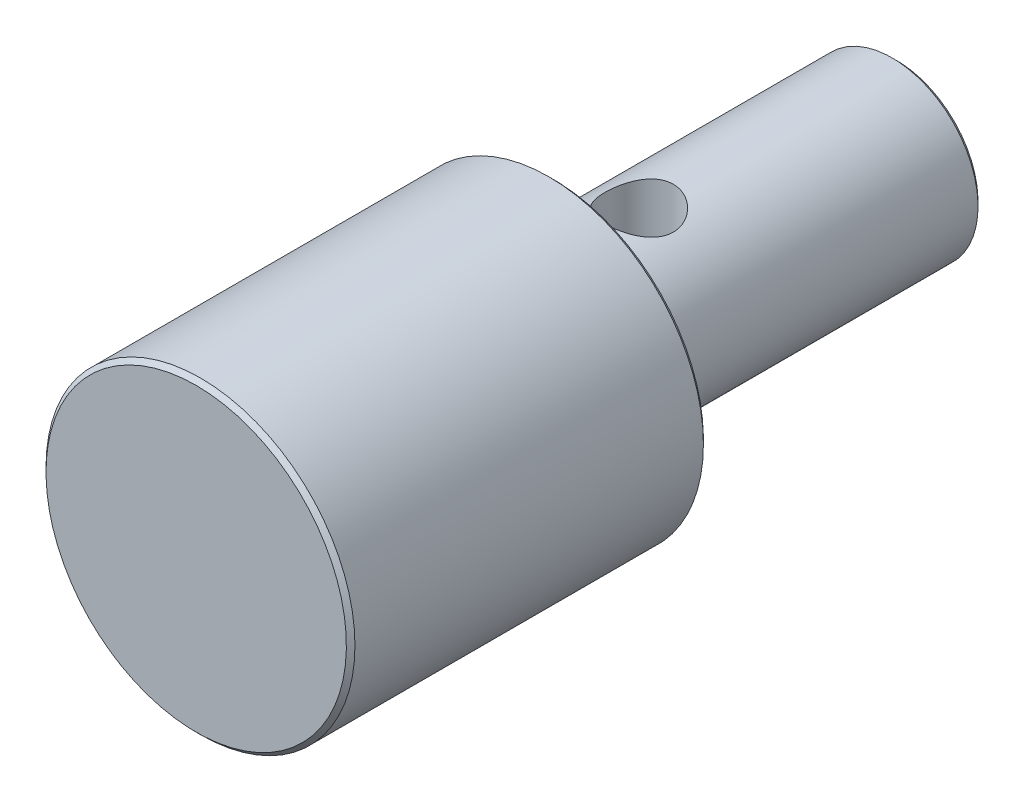
ISO-10303-21;
HEADER;
FILE_DESCRIPTION(('STEP AP214'),'2;1');
FILE_NAME('part.step','',(''),(''),'','','');
FILE_SCHEMA(('AUTOMOTIVE_DESIGN { 1 0 10303 214 1 1 1 1 }'));
ENDSEC;
DATA;
#1=APPLICATION_CONTEXT('core data for automotive mechanical design processes');
#2=APPLICATION_PROTOCOL_DEFINITION('international standard','automotive_design',2000,#1);
#3=PRODUCT_CONTEXT('',#1,'mechanical');
#4=PRODUCT('Part','Part','',(#3));
#5=PRODUCT_RELATED_PRODUCT_CATEGORY('part','',(#4));
#6=PRODUCT_DEFINITION_FORMATION('','',#4);
#7=PRODUCT_DEFINITION_CONTEXT('part definition',#1,'design');
#8=PRODUCT_DEFINITION('design','',#6,#7);
#9=PRODUCT_DEFINITION_SHAPE('','',#8);
#10=(LENGTH_UNIT() NAMED_UNIT(*) SI_UNIT(.MILLI.,.METRE.));
#11=(NAMED_UNIT(*) PLANE_ANGLE_UNIT() SI_UNIT($,.RADIAN.));
#12=(NAMED_UNIT(*) SI_UNIT($,.STERADIAN.) SOLID_ANGLE_UNIT());
#13=UNCERTAINTY_MEASURE_WITH_UNIT(LENGTH_MEASURE(1.E-05),#10,'distance_accuracy_value','');
#14=(GEOMETRIC_REPRESENTATION_CONTEXT(3) GLOBAL_UNCERTAINTY_ASSIGNED_CONTEXT((#13)) GLOBAL_UNIT_ASSIGNED_CONTEXT((#10,
#11,#12)) REPRESENTATION_CONTEXT('',''));
#15=CARTESIAN_POINT('',(0.,0.,0.));
#16=DIRECTION('',(0.,0.,1.));
#17=DIRECTION('',(1.,0.,0.));
#18=AXIS2_PLACEMENT_3D('',#15,#16,#17);
#19=CARTESIAN_POINT('',(0.,0.,0.));
#20=DIRECTION('',(0.,0.,-1.));
#21=DIRECTION('',(0.,1.,0.));
#22=AXIS2_PLACEMENT_3D('',#19,#20,#21);
#23=PLANE('',#22);
#24=CARTESIAN_POINT('',(0.,0.,0.));
#25=DIRECTION('',(0.,0.,-1.));
#26=DIRECTION('',(0.,1.,0.));
#27=AXIS2_PLACEMENT_3D('',#24,#25,#26);
#28=CIRCLE('',#27,17.5);
#29=CARTESIAN_POINT('',(0.,17.5,0.));
#30=VERTEX_POINT('',#29);
#31=EDGE_CURVE('E65',#30,#30,#28,.F.);
#32=ORIENTED_EDGE('',*,*,#31,.T.);
#33=EDGE_LOOP('',(#32));
#34=FACE_BOUND('',#33,.T.);
#35=ADVANCED_FACE('F37',(#34),#23,.F.);
#36=CARTESIAN_POINT('',(0.,0.,0.));
#37=DIRECTION('',(0.,0.,1.));
#38=DIRECTION('',(0.,-1.,0.));
#39=AXIS2_PLACEMENT_3D('',#36,#37,#38);
#40=CYLINDRICAL_SURFACE('',#39,18.);
#41=CARTESIAN_POINT('',(0.,0.,-0.500000000000004));
#42=DIRECTION('',(0.,0.,-1.));
#43=DIRECTION('',(0.,1.,0.));
#44=AXIS2_PLACEMENT_3D('',#41,#42,#43);
#45=CIRCLE('',#44,18.);
#46=CARTESIAN_POINT('',(0.,18.,-0.500000000000004));
#47=VERTEX_POINT('',#46);
#48=EDGE_CURVE('E55',#47,#47,#45,.T.);
#49=ORIENTED_EDGE('',*,*,#48,.T.);
#50=EDGE_LOOP('',(#49));
#51=FACE_BOUND('',#50,.T.);
#52=CARTESIAN_POINT('',(0.,0.,-41.1));
#53=DIRECTION('',(0.,0.,1.));
#54=DIRECTION('',(0.,-1.,0.));
#55=AXIS2_PLACEMENT_3D('',#52,#53,#54);
#56=CIRCLE('',#55,18.);
#57=CARTESIAN_POINT('',(0.,-18.,-41.1));
#58=VERTEX_POINT('',#57);
#59=EDGE_CURVE('E61',#58,#58,#56,.T.);
#60=ORIENTED_EDGE('',*,*,#59,.T.);
#61=EDGE_LOOP('',(#60));
#62=FACE_BOUND('',#61,.T.);
#63=ADVANCED_FACE('F107',(#51,#62),#40,.T.);
#64=CARTESIAN_POINT('',(0.,18.,-41.6));
#65=DIRECTION('',(0.,0.,1.));
#66=DIRECTION('',(0.,-1.,0.));
#67=AXIS2_PLACEMENT_3D('',#64,#65,#66);
#68=PLANE('',#67);
#69=CARTESIAN_POINT('',(0.,0.,-41.6));
#70=DIRECTION('',(0.,0.,1.));
#71=DIRECTION('',(0.,-1.,0.));
#72=AXIS2_PLACEMENT_3D('',#69,#70,#71);
#73=CIRCLE('',#72,17.5);
#74=CARTESIAN_POINT('',(0.,-17.5,-41.6));
#75=VERTEX_POINT('',#74);
#76=EDGE_CURVE('E50',#75,#75,#73,.F.);
#77=ORIENTED_EDGE('',*,*,#76,.T.);
#78=EDGE_LOOP('',(#77));
#79=FACE_BOUND('',#78,.T.);
#80=CARTESIAN_POINT('',(0.,0.,-41.6));
#81=DIRECTION('',(0.,0.,1.));
#82=DIRECTION('',(0.,-1.,0.));
#83=AXIS2_PLACEMENT_3D('',#80,#81,#82);
#84=CIRCLE('',#83,10.5);
#85=CARTESIAN_POINT('',(0.,-10.5,-41.6));
#86=VERTEX_POINT('',#85);
#87=EDGE_CURVE('E73',#86,#86,#84,.T.);
#88=ORIENTED_EDGE('',*,*,#87,.T.);
#89=EDGE_LOOP('',(#88));
#90=FACE_BOUND('',#89,.T.);
#91=ADVANCED_FACE('F105',(#79,#90),#68,.F.);
#92=CARTESIAN_POINT('',(0.,0.,0.));
#93=DIRECTION('',(0.,0.,1.));
#94=DIRECTION('',(0.,-1.,0.));
#95=AXIS2_PLACEMENT_3D('',#92,#93,#94);
#96=CYLINDRICAL_SURFACE('',#95,10.);
#97=CARTESIAN_POINT('',(0.,0.,-81.1));
#98=DIRECTION('',(0.,0.,1.));
#99=DIRECTION('',(0.,-1.,0.));
#100=AXIS2_PLACEMENT_3D('',#97,#98,#99);
#101=CIRCLE('',#100,10.);
#102=CARTESIAN_POINT('',(0.,-10.,-81.1));
#103=VERTEX_POINT('',#102);
#104=EDGE_CURVE('E45',#103,#103,#101,.T.);
#105=ORIENTED_EDGE('',*,*,#104,.T.);
#106=EDGE_LOOP('',(#105));
#107=FACE_BOUND('',#106,.T.);
#108=CARTESIAN_POINT('',(0.,0.,-42.1));
#109=DIRECTION('',(0.,0.,1.));
#110=DIRECTION('',(0.,-1.,0.));
#111=AXIS2_PLACEMENT_3D('',#108,#109,#110);
#112=CIRCLE('',#111,10.);
#113=CARTESIAN_POINT('',(0.,-10.,-42.1));
#114=VERTEX_POINT('',#113);
#115=EDGE_CURVE('E69',#114,#114,#112,.F.);
#116=ORIENTED_EDGE('',*,*,#115,.T.);
#117=EDGE_LOOP('',(#116));
#118=FACE_BOUND('',#117,.T.);
#119=CARTESIAN_POINT('',(0.,-10.,-55.6));
#120=CARTESIAN_POINT('',(-0.107549581345535,-9.99999886871264,-55.5999984250671));
#121=CARTESIAN_POINT('',(-0.215132147940359,-9.99825999367799,-55.5956563289199));
#122=CARTESIAN_POINT('',(-0.429535200549545,-9.99134740691108,-55.5783266172161));
#123=CARTESIAN_POINT('',(-0.536355162703297,-9.98617152790588,-55.5653335465974));
#124=CARTESIAN_POINT('',(-0.748635856497413,-9.97250573560118,-55.5307919654494));
#125=CARTESIAN_POINT('',(-0.854093134440867,-9.96400865312144,-55.5092249453802));
#126=CARTESIAN_POINT('',(-1.06266761114009,-9.94393017211574,-55.4577582695632));
#127=CARTESIAN_POINT('',(-1.16578384227259,-9.932347522545,-55.4278552337447));
#128=CARTESIAN_POINT('',(-1.46979509681069,-9.89349112162205,-55.326277191284));
#129=CARTESIAN_POINT('',(-1.66629107461992,-9.86204458846135,-55.2425781809936));
#130=CARTESIAN_POINT('',(-2.04217417878102,-9.79113035538708,-55.0459537826502));
#131=CARTESIAN_POINT('',(-2.22156721456799,-9.75166544086262,-54.9330385398851));
#132=CARTESIAN_POINT('',(-2.56699339938209,-9.66661825353092,-54.6755312454783));
#133=CARTESIAN_POINT('',(-2.73212223266508,-9.62084608086599,-54.5297872894244));
#134=CARTESIAN_POINT('',(-3.03635232313263,-9.52921139577232,-54.213199390848));
#135=CARTESIAN_POINT('',(-3.17544084661153,-9.48334885017047,-54.0423432409835));
#136=CARTESIAN_POINT('',(-3.42974847409894,-9.39445587657958,-53.6711440314337));
#137=CARTESIAN_POINT('',(-3.54362978572887,-9.35164233015934,-53.4698270739363));
#138=CARTESIAN_POINT('',(-3.73550961465234,-9.2766729328807,-53.0489271571991));
#139=CARTESIAN_POINT('',(-3.81352517485723,-9.24451202207146,-52.8293529322586));
#140=CARTESIAN_POINT('',(-3.92779760260542,-9.19652715590089,-52.3885753443142));
#141=CARTESIAN_POINT('',(-3.96578791979826,-9.18002840771385,-52.1678975319119));
#142=CARTESIAN_POINT('',(-4.00434593508728,-9.16328008038143,-51.7227300003227));
#143=CARTESIAN_POINT('',(-4.00493203570086,-9.16302251073203,-51.4982422099889));
#144=CARTESIAN_POINT('',(-3.9699787321474,-9.17821000534301,-51.0684866577768));
#145=CARTESIAN_POINT('',(-3.93695062778272,-9.19256349925667,-50.8629685712344));
#146=CARTESIAN_POINT('',(-3.83989376129508,-9.23352375055553,-50.4606808876497));
#147=CARTESIAN_POINT('',(-3.77585958980135,-9.26013264599921,-50.2639128236937));
#148=CARTESIAN_POINT('',(-3.6173894649114,-9.32318970221162,-49.8799643277081));
#149=CARTESIAN_POINT('',(-3.52235972457939,-9.35982758573424,-49.6930615219175));
#150=CARTESIAN_POINT('',(-3.30501292151569,-9.43876232767927,-49.33716836725));
#151=CARTESIAN_POINT('',(-3.1826856102159,-9.48106130910412,-49.1681847811869));
#152=CARTESIAN_POINT('',(-2.90310119889356,-9.57053473488081,-48.839180542404));
#153=CARTESIAN_POINT('',(-2.74387492593717,-9.61783329953252,-48.6808625411101));
#154=CARTESIAN_POINT('',(-2.40062885486449,-9.70919649915615,-48.3926310439938));
#155=CARTESIAN_POINT('',(-2.21660413066998,-9.75326048890393,-48.2627232051788));
#156=CARTESIAN_POINT('',(-1.82415530521056,-9.83429362529359,-48.0327651051689));
#157=CARTESIAN_POINT('',(-1.61532098269266,-9.87110540190899,-47.9333554376061));
#158=CARTESIAN_POINT('',(-1.18204753096606,-9.93229656657448,-47.7716642778437));
#159=CARTESIAN_POINT('',(-0.9576163936994,-9.95668226924746,-47.7093639248851));
#160=CARTESIAN_POINT('',(-0.51379177521559,-9.98912279013839,-47.6271034091606));
#161=CARTESIAN_POINT('',(-0.294886587971139,-9.99805891667035,-47.6048550914929));
#162=CARTESIAN_POINT('',(0.143690619615708,-10.0013695702126,-47.5965737989427));
#163=CARTESIAN_POINT('',(0.363362426448185,-9.99574787164577,-47.6105314369048));
#164=CARTESIAN_POINT('',(0.786865478243658,-9.97115134127512,-47.6725835051041));
#165=CARTESIAN_POINT('',(0.990964983549766,-9.95278782691064,-47.7191159607025));
#166=CARTESIAN_POINT('',(1.38827085612275,-9.90518882810983,-47.842871416619));
#167=CARTESIAN_POINT('',(1.58147582045412,-9.87595194712999,-47.9200983593352));
#168=CARTESIAN_POINT('',(1.95815757162884,-9.80833189541687,-48.1055698793621));
#169=CARTESIAN_POINT('',(2.14115604549353,-9.76969631959847,-48.2146909440947));
#170=CARTESIAN_POINT('',(2.4868871825104,-9.68746729490809,-48.4598806478029));
#171=CARTESIAN_POINT('',(2.64961168158685,-9.64387186219643,-48.5959600858139));
#172=CARTESIAN_POINT('',(2.96144608598878,-9.55290235277181,-48.9017400259326));
#173=CARTESIAN_POINT('',(3.10894786734725,-9.50546882853788,-49.0730670831408));
#174=CARTESIAN_POINT('',(3.37350239509234,-9.41483345830581,-49.4388801658903));
#175=CARTESIAN_POINT('',(3.49055012366591,-9.37163231039242,-49.6333700001994));
#176=CARTESIAN_POINT('',(3.69161500286277,-9.2942859982933,-50.0429233896733));
#177=CARTESIAN_POINT('',(3.77530118531766,-9.2602326182174,-50.2581680002435));
#178=CARTESIAN_POINT('',(3.90459244315908,-9.20647346903737,-50.7014673016128));
#179=CARTESIAN_POINT('',(3.95022562452798,-9.18675711197461,-50.9295124048418));
#180=CARTESIAN_POINT('',(3.99943122157417,-9.16543518780389,-51.374255809844));
#181=CARTESIAN_POINT('',(4.0057941177721,-9.16262842667612,-51.590589701895));
#182=CARTESIAN_POINT('',(3.98360636538274,-9.17229671415009,-52.0210896927211));
#183=CARTESIAN_POINT('',(3.9550601501471,-9.18476982225497,-52.2352560632825));
#184=CARTESIAN_POINT('',(3.86614256488129,-9.2225330048627,-52.6466644608903));
#185=CARTESIAN_POINT('',(3.80707437387707,-9.2472967218297,-52.8442408462211));
#186=CARTESIAN_POINT('',(3.66001151041638,-9.30647993934966,-53.2267569617897));
#187=CARTESIAN_POINT('',(3.5720088493455,-9.34090210615105,-53.4116931851113));
#188=CARTESIAN_POINT('',(3.36374310804133,-9.41797252826471,-53.7752204107095));
#189=CARTESIAN_POINT('',(3.24192140926543,-9.46097893410836,-53.9528418306883));
#190=CARTESIAN_POINT('',(2.97179350239177,-9.54927479921252,-54.2859821426248));
#191=CARTESIAN_POINT('',(2.82347931168581,-9.59456494363941,-54.44149434729));
#192=CARTESIAN_POINT('',(2.492974124467,-9.68587647140965,-54.7364235925306));
#193=CARTESIAN_POINT('',(2.30921017071955,-9.73175488236393,-54.8741433839823));
#194=CARTESIAN_POINT('',(2.01716584575533,-9.7949502762577,-55.0560481089375));
#195=CARTESIAN_POINT('',(1.91699501972425,-9.81509269692656,-55.112607063853));
#196=CARTESIAN_POINT('',(1.7118011098248,-9.85294835133019,-55.2170379954053));
#197=CARTESIAN_POINT('',(1.60678027559742,-9.87066269647666,-55.264913949808));
#198=CARTESIAN_POINT('',(1.39454646904328,-9.9028559935491,-55.350747984685));
#199=CARTESIAN_POINT('',(1.28740777135872,-9.91738778532477,-55.3888701547472));
#200=CARTESIAN_POINT('',(1.06995577523384,-9.94319722915714,-55.4559213477213));
#201=CARTESIAN_POINT('',(0.959643983352622,-9.95447639837582,-55.4848546573499));
#202=CARTESIAN_POINT('',(0.736945215856839,-9.97343330649399,-55.533174836149));
#203=CARTESIAN_POINT('',(0.624564263591283,-9.98112017494336,-55.552585911645));
#204=CARTESIAN_POINT('',(0.398419132407604,-9.99270031578293,-55.5817385706662));
#205=CARTESIAN_POINT('',(0.284655994966353,-9.99659628445551,-55.5914870268343));
#206=CARTESIAN_POINT('',(0.113830463425491,-9.99951445883957,-55.5987858955735));
#207=CARTESIAN_POINT('',(0.0569198512645295,-10.0000005987258,-55.6000008335221));
#208=CARTESIAN_POINT('',(0.,-10.,-55.6));
#209=B_SPLINE_CURVE_WITH_KNOTS('',3,(#119,#120,#121,#122,#123,#124,#125,#126,#127,#128,#129,
#130,#131,#132,#133,#134,#135,#136,#137,#138,#139,#140,#141,#142,#143,#144,#145,#146,#147,#148,
#149,#150,#151,#152,#153,#154,#155,#156,#157,#158,#159,#160,#161,#162,#163,#164,#165,#166,#167,
#168,#169,#170,#171,#172,#173,#174,#175,#176,#177,#178,#179,#180,#181,#182,#183,#184,#185,#186,
#187,#188,#189,#190,#191,#192,#193,#194,#195,#196,#197,#198,#199,#200,#201,#202,#203,#204,#205,
#206,#207,#208),.UNSPECIFIED.,.T.,.F.,(4,2,2,2,2,2,2,2,2,2,2,2,2,2,2,2,2,2,2,2,2,2,2,2,2,2,2,2,
2,2,2,2,2,2,2,2,2,2,2,2,2,2,2,2,4),(0.,0.322603993422152,0.645411604786479,0.968919914471235,
1.29255959093095,1.93701523385824,2.58124739027476,3.25313995292302,3.9253602176033,
4.62749749529941,5.32930078128044,5.99927442509165,6.66891844572484,7.29195888698823,
7.91510806412271,8.55097484497807,9.18708075776542,9.87235930273289,10.5577741757964,
11.2567305822579,11.9553314412776,12.6125760095619,13.2696501904034,13.8972014302891,
14.5248332988777,15.171662586967,15.8187515089811,16.50856181149,17.1984856998767,
17.8950932218183,18.5911857719204,19.2371857868567,19.8831037702627,20.5034786899771,
21.124025035105,21.7801016801356,22.4363763459696,23.1352007896785,23.4851924266232,
23.8350233218042,24.1785111324565,24.52183846562,24.8642884495951,25.2064946871486,
25.3772305569977),.UNSPECIFIED.);
#210=CARTESIAN_POINT('',(0.,-10.,-55.6));
#211=VERTEX_POINT('',#210);
#212=EDGE_CURVE('E78',#211,#211,#209,.T.);
#213=ORIENTED_EDGE('',*,*,#212,.T.);
#214=EDGE_LOOP('',(#213));
#215=FACE_BOUND('',#214,.T.);
#216=CARTESIAN_POINT('',(0.,9.99999999999999,-47.6));
#217=CARTESIAN_POINT('',(-0.107549581345536,9.99999886871263,-47.6000015749329));
#218=CARTESIAN_POINT('',(-0.215132147940361,9.99825999367799,-47.6043436710802));
#219=CARTESIAN_POINT('',(-0.429535200549548,9.99134740691108,-47.6216733827839));
#220=CARTESIAN_POINT('',(-0.536355162703301,9.98617152790588,-47.6346664534026));
#221=CARTESIAN_POINT('',(-0.748635856497416,9.97250573560117,-47.6692080345506));
#222=CARTESIAN_POINT('',(-0.854093134440869,9.96400865312144,-47.6907750546198));
#223=CARTESIAN_POINT('',(-1.0626676111401,9.94393017211574,-47.7422417304368));
#224=CARTESIAN_POINT('',(-1.1657838422726,9.932347522545,-47.7721447662553));
#225=CARTESIAN_POINT('',(-1.46979509681069,9.89349112162204,-47.873722808716));
#226=CARTESIAN_POINT('',(-1.66629107461992,9.86204458846134,-47.9574218190064));
#227=CARTESIAN_POINT('',(-2.04217417878102,9.79113035538708,-48.1540462173498));
#228=CARTESIAN_POINT('',(-2.22156721456799,9.75166544086262,-48.2669614601149));
#229=CARTESIAN_POINT('',(-2.56699339938209,9.66661825353091,-48.5244687545217));
#230=CARTESIAN_POINT('',(-2.73212223266509,9.62084608086599,-48.6702127105756));
#231=CARTESIAN_POINT('',(-3.03635232313264,9.52921139577231,-48.986800609152));
#232=CARTESIAN_POINT('',(-3.17544084661154,9.48334885017046,-49.1576567590165));
#233=CARTESIAN_POINT('',(-3.42974847409894,9.39445587657958,-49.5288559685663));
#234=CARTESIAN_POINT('',(-3.54362978572887,9.35164233015934,-49.7301729260637));
#235=CARTESIAN_POINT('',(-3.73550961465234,9.2766729328807,-50.1510728428009));
#236=CARTESIAN_POINT('',(-3.81352517485723,9.24451202207146,-50.3706470677414));
#237=CARTESIAN_POINT('',(-3.92779760260542,9.19652715590089,-50.8114246556858));
#238=CARTESIAN_POINT('',(-3.96578791979826,9.18002840771385,-51.0321024680881));
#239=CARTESIAN_POINT('',(-4.00434593508728,9.16328008038142,-51.4772699996773));
#240=CARTESIAN_POINT('',(-4.00493203570086,9.16302251073202,-51.7017577900111));
#241=CARTESIAN_POINT('',(-3.9699787321474,9.17821000534301,-52.1315133422232));
#242=CARTESIAN_POINT('',(-3.93695062778272,9.19256349925666,-52.3370314287657));
#243=CARTESIAN_POINT('',(-3.83989376129508,9.23352375055553,-52.7393191123504));
#244=CARTESIAN_POINT('',(-3.77585958980135,9.26013264599921,-52.9360871763063));
#245=CARTESIAN_POINT('',(-3.6173894649114,9.32318970221162,-53.3200356722919));
#246=CARTESIAN_POINT('',(-3.52235972457939,9.35982758573424,-53.5069384780825));
#247=CARTESIAN_POINT('',(-3.30501292151569,9.43876232767927,-53.86283163275));
#248=CARTESIAN_POINT('',(-3.1826856102159,9.48106130910411,-54.0318152188131));
#249=CARTESIAN_POINT('',(-2.90310119889356,9.57053473488081,-54.360819457596));
#250=CARTESIAN_POINT('',(-2.74387492593717,9.61783329953252,-54.5191374588899));
#251=CARTESIAN_POINT('',(-2.40062885486449,9.70919649915614,-54.8073689560062));
#252=CARTESIAN_POINT('',(-2.21660413066998,9.75326048890393,-54.9372767948212));
#253=CARTESIAN_POINT('',(-1.82415530521056,9.83429362529358,-55.1672348948311));
#254=CARTESIAN_POINT('',(-1.61532098269266,9.87110540190899,-55.2666445623939));
#255=CARTESIAN_POINT('',(-1.18204753096606,9.93229656657448,-55.4283357221563));
#256=CARTESIAN_POINT('',(-0.957616393699399,9.95668226924746,-55.4906360751149));
#257=CARTESIAN_POINT('',(-0.51379177521559,9.98912279013838,-55.5728965908394));
#258=CARTESIAN_POINT('',(-0.294886587971139,9.99805891667034,-55.5951449085071));
#259=CARTESIAN_POINT('',(0.143690619615708,10.0013695702126,-55.6034262010573));
#260=CARTESIAN_POINT('',(0.363362426448185,9.99574787164577,-55.5894685630952));
#261=CARTESIAN_POINT('',(0.786865478243658,9.97115134127512,-55.5274164948959));
#262=CARTESIAN_POINT('',(0.990964983549765,9.95278782691063,-55.4808840392975));
#263=CARTESIAN_POINT('',(1.38827085612275,9.90518882810983,-55.357128583381));
#264=CARTESIAN_POINT('',(1.58147582045412,9.87595194712999,-55.2799016406648));
#265=CARTESIAN_POINT('',(1.95815757162884,9.80833189541687,-55.0944301206379));
#266=CARTESIAN_POINT('',(2.14115604549354,9.76969631959847,-54.9853090559053));
#267=CARTESIAN_POINT('',(2.4868871825104,9.68746729490809,-54.7401193521971));
#268=CARTESIAN_POINT('',(2.64961168158685,9.64387186219642,-54.6040399141861));
#269=CARTESIAN_POINT('',(2.96144608598878,9.55290235277181,-54.2982599740674));
#270=CARTESIAN_POINT('',(3.10894786734726,9.50546882853787,-54.1269329168592));
#271=CARTESIAN_POINT('',(3.37350239509234,9.4148334583058,-53.7611198341097));
#272=CARTESIAN_POINT('',(3.49055012366591,9.37163231039242,-53.5666299998006));
#273=CARTESIAN_POINT('',(3.69161500286277,9.2942859982933,-53.1570766103267));
#274=CARTESIAN_POINT('',(3.77530118531766,9.2602326182174,-52.9418319997565));
#275=CARTESIAN_POINT('',(3.90459244315909,9.20647346903736,-52.4985326983872));
#276=CARTESIAN_POINT('',(3.95022562452798,9.1867571119746,-52.2704875951582));
#277=CARTESIAN_POINT('',(3.99943122157417,9.16543518780389,-51.825744190156));
#278=CARTESIAN_POINT('',(4.0057941177721,9.16262842667612,-51.609410298105));
#279=CARTESIAN_POINT('',(3.98360636538274,9.17229671415009,-51.1789103072789));
#280=CARTESIAN_POINT('',(3.9550601501471,9.18476982225497,-50.9647439367175));
#281=CARTESIAN_POINT('',(3.86614256488129,9.2225330048627,-50.5533355391097));
#282=CARTESIAN_POINT('',(3.80707437387706,9.2472967218297,-50.3557591537789));
#283=CARTESIAN_POINT('',(3.66001151041637,9.30647993934966,-49.9732430382103));
#284=CARTESIAN_POINT('',(3.5720088493455,9.34090210615105,-49.7883068148887));
#285=CARTESIAN_POINT('',(3.36374310804133,9.41797252826471,-49.4247795892905));
#286=CARTESIAN_POINT('',(3.24192140926543,9.46097893410836,-49.2471581693117));
#287=CARTESIAN_POINT('',(2.97179350239177,9.54927479921251,-48.9140178573752));
#288=CARTESIAN_POINT('',(2.82347931168581,9.59456494363941,-48.75850565271));
#289=CARTESIAN_POINT('',(2.49297412446699,9.68587647140964,-48.4635764074694));
#290=CARTESIAN_POINT('',(2.30921017071955,9.73175488236392,-48.3258566160177));
#291=CARTESIAN_POINT('',(2.01716584575533,9.7949502762577,-48.1439518910625));
#292=CARTESIAN_POINT('',(1.91699501972424,9.81509269692655,-48.087392936147));
#293=CARTESIAN_POINT('',(1.7118011098248,9.85294835133019,-47.9829620045947));
#294=CARTESIAN_POINT('',(1.60678027559742,9.87066269647665,-47.935086050192));
#295=CARTESIAN_POINT('',(1.39454646904328,9.9028559935491,-47.849252015315));
#296=CARTESIAN_POINT('',(1.28740777135872,9.91738778532477,-47.8111298452528));
#297=CARTESIAN_POINT('',(1.06995577523383,9.94319722915714,-47.7440786522787));
#298=CARTESIAN_POINT('',(0.959643983352618,9.95447639837582,-47.7151453426501));
#299=CARTESIAN_POINT('',(0.736945215856835,9.97343330649399,-47.666825163851));
#300=CARTESIAN_POINT('',(0.624564263591281,9.98112017494335,-47.647414088355));
#301=CARTESIAN_POINT('',(0.398419132407603,9.99270031578293,-47.6182614293338));
#302=CARTESIAN_POINT('',(0.284655994966351,9.99659628445551,-47.6085129731657));
#303=CARTESIAN_POINT('',(0.11383046342549,9.99951445883957,-47.6012141044266));
#304=CARTESIAN_POINT('',(0.0569198512645291,10.0000005987258,-47.5999991664779));
#305=CARTESIAN_POINT('',(0.,9.99999999999999,-47.6));
#306=B_SPLINE_CURVE_WITH_KNOTS('',3,(#216,#217,#218,#219,#220,#221,#222,#223,#224,#225,#226,
#227,#228,#229,#230,#231,#232,#233,#234,#235,#236,#237,#238,#239,#240,#241,#242,#243,#244,#245,
#246,#247,#248,#249,#250,#251,#252,#253,#254,#255,#256,#257,#258,#259,#260,#261,#262,#263,#264,
#265,#266,#267,#268,#269,#270,#271,#272,#273,#274,#275,#276,#277,#278,#279,#280,#281,#282,#283,
#284,#285,#286,#287,#288,#289,#290,#291,#292,#293,#294,#295,#296,#297,#298,#299,#300,#301,#302,
#303,#304,#305),.UNSPECIFIED.,.T.,.F.,(4,2,2,2,2,2,2,2,2,2,2,2,2,2,2,2,2,2,2,2,2,2,2,2,2,2,2,2,
2,2,2,2,2,2,2,2,2,2,2,2,2,2,2,2,4),(0.,0.322603993422154,0.645411604786482,0.968919914471236,
1.29255959093095,1.93701523385824,2.58124739027476,3.25313995292302,3.92536021760331,
4.62749749529941,5.32930078128044,5.99927442509165,6.66891844572484,7.29195888698824,
7.91510806412271,8.55097484497807,9.18708075776542,9.87235930273289,10.5577741757964,
11.2567305822579,11.9553314412776,12.6125760095619,13.2696501904034,13.8972014302891,
14.5248332988777,15.171662586967,15.8187515089811,16.50856181149,17.1984856998767,
17.8950932218183,18.5911857719204,19.2371857868567,19.8831037702627,20.5034786899772,
21.124025035105,21.7801016801356,22.4363763459696,23.1352007896785,23.4851924266232,
23.8350233218042,24.1785111324565,24.52183846562,24.8642884495951,25.2064946871486,
25.3772305569977),.UNSPECIFIED.);
#307=CARTESIAN_POINT('',(0.,9.99999999999999,-47.6));
#308=VERTEX_POINT('',#307);
#309=EDGE_CURVE('E77',#308,#308,#306,.T.);
#310=ORIENTED_EDGE('',*,*,#309,.T.);
#311=EDGE_LOOP('',(#310));
#312=FACE_BOUND('',#311,.T.);
#313=ADVANCED_FACE('F90',(#107,#118,#215,#312),#96,.T.);
#314=CARTESIAN_POINT('',(0.,10.,-81.6));
#315=DIRECTION('',(0.,0.,1.));
#316=DIRECTION('',(0.,-1.,0.));
#317=AXIS2_PLACEMENT_3D('',#314,#315,#316);
#318=PLANE('',#317);
#319=CARTESIAN_POINT('',(0.,0.,-81.6));
#320=DIRECTION('',(0.,0.,1.));
#321=DIRECTION('',(0.,-1.,0.));
#322=AXIS2_PLACEMENT_3D('',#319,#320,#321);
#323=CIRCLE('',#322,9.49999999999999);
#324=CARTESIAN_POINT('',(0.,-9.49999999999999,-81.6));
#325=VERTEX_POINT('',#324);
#326=EDGE_CURVE('E10',#325,#325,#323,.F.);
#327=ORIENTED_EDGE('',*,*,#326,.T.);
#328=EDGE_LOOP('',(#327));
#329=FACE_BOUND('',#328,.T.);
#330=ADVANCED_FACE('F98',(#329),#318,.F.);
#331=CARTESIAN_POINT('',(0.,-18.,-51.6));
#332=DIRECTION('',(0.,1.,0.));
#333=DIRECTION('',(0.,0.,1.));
#334=AXIS2_PLACEMENT_3D('',#331,#332,#333);
#335=CYLINDRICAL_SURFACE('',#334,4.);
#336=ORIENTED_EDGE('',*,*,#212,.F.);
#337=EDGE_LOOP('',(#336));
#338=FACE_BOUND('',#337,.T.);
#339=ORIENTED_EDGE('',*,*,#309,.F.);
#340=EDGE_LOOP('',(#339));
#341=FACE_BOUND('',#340,.T.);
#342=ADVANCED_FACE('F94',(#338,#341),#335,.F.);
#343=CARTESIAN_POINT('',(0.,0.,-42.1));
#344=DIRECTION('',(0.,0.,1.));
#345=DIRECTION('',(0.,-1.,0.));
#346=AXIS2_PLACEMENT_3D('',#343,#344,#345);
#347=TOROIDAL_SURFACE('',#346,10.5,0.5);
#348=ORIENTED_EDGE('',*,*,#115,.F.);
#349=EDGE_LOOP('',(#348));
#350=FACE_BOUND('',#349,.T.);
#351=ORIENTED_EDGE('',*,*,#87,.F.);
#352=EDGE_LOOP('',(#351));
#353=FACE_BOUND('',#352,.T.);
#354=ADVANCED_FACE('F97',(#350,#353),#347,.F.);
#355=CARTESIAN_POINT('',(0.,0.,0.));
#356=DIRECTION('',(0.,0.,-1.));
#357=DIRECTION('',(0.,1.,0.));
#358=AXIS2_PLACEMENT_3D('',#355,#356,#357);
#359=CONICAL_SURFACE('',#358,17.5,0.785398163397442);
#360=ORIENTED_EDGE('',*,*,#48,.F.);
#361=EDGE_LOOP('',(#360));
#362=FACE_BOUND('',#361,.T.);
#363=ORIENTED_EDGE('',*,*,#31,.F.);
#364=EDGE_LOOP('',(#363));
#365=FACE_BOUND('',#364,.T.);
#366=ADVANCED_FACE('F118',(#362,#365),#359,.T.);
#367=CARTESIAN_POINT('',(0.,0.,-41.1));
#368=DIRECTION('',(0.,0.,1.));
#369=DIRECTION('',(0.,-1.,0.));
#370=AXIS2_PLACEMENT_3D('',#367,#368,#369);
#371=CONICAL_SURFACE('',#370,18.,0.785398163397452);
#372=ORIENTED_EDGE('',*,*,#76,.F.);
#373=EDGE_LOOP('',(#372));
#374=FACE_BOUND('',#373,.T.);
#375=ORIENTED_EDGE('',*,*,#59,.F.);
#376=EDGE_LOOP('',(#375));
#377=FACE_BOUND('',#376,.T.);
#378=ADVANCED_FACE('F121',(#374,#377),#371,.T.);
#379=CARTESIAN_POINT('',(0.,0.,-81.1));
#380=DIRECTION('',(0.,0.,1.));
#381=DIRECTION('',(0.,-1.,0.));
#382=AXIS2_PLACEMENT_3D('',#379,#380,#381);
#383=CONICAL_SURFACE('',#382,10.,0.785398163397447);
#384=ORIENTED_EDGE('',*,*,#326,.F.);
#385=EDGE_LOOP('',(#384));
#386=FACE_BOUND('',#385,.T.);
#387=ORIENTED_EDGE('',*,*,#104,.F.);
#388=EDGE_LOOP('',(#387));
#389=FACE_BOUND('',#388,.T.);
#390=ADVANCED_FACE('F39',(#386,#389),#383,.T.);
#391=CLOSED_SHELL('',(#35,#63,#91,#313,#330,#342,#354,#366,#378,#390));
#392=MANIFOLD_SOLID_BREP('B2',#391);
#393=ADVANCED_BREP_SHAPE_REPRESENTATION('',(#18,#392),#14);
#394=SHAPE_DEFINITION_REPRESENTATION(#9,#393);
ENDSEC;
END-ISO-10303-21;
